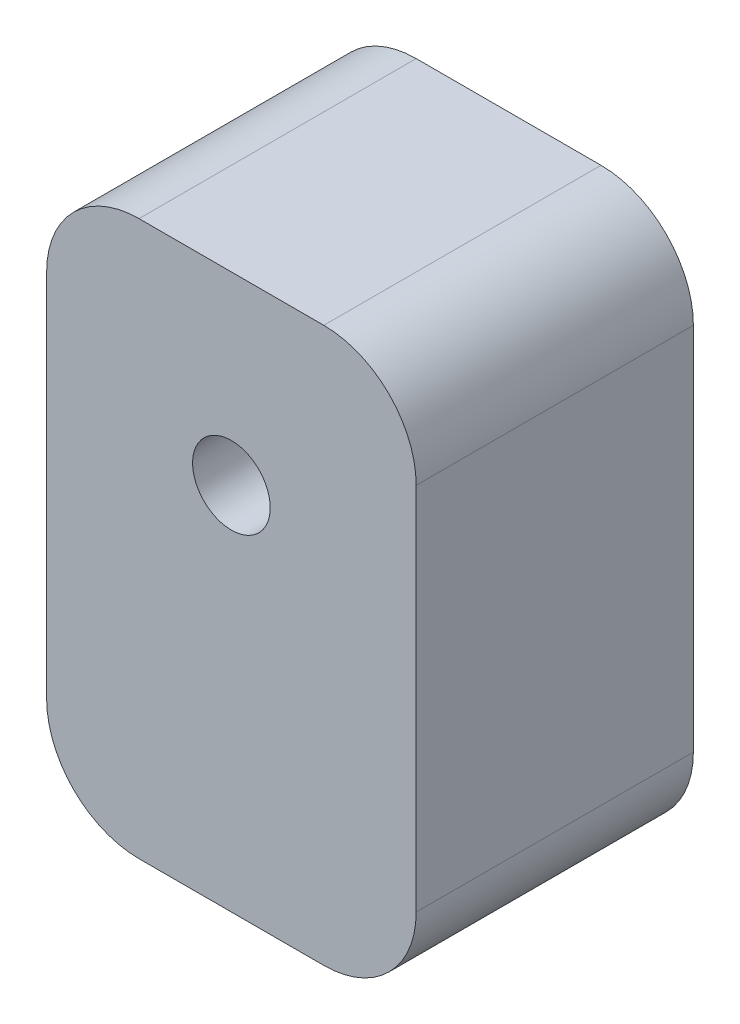
ISO-10303-21;
HEADER;
FILE_DESCRIPTION(('STEP AP214'),'2;1');
FILE_NAME('part.step','',(''),(''),'','','');
FILE_SCHEMA(('AUTOMOTIVE_DESIGN { 1 0 10303 214 1 1 1 1 }'));
ENDSEC;
DATA;
#1=APPLICATION_CONTEXT('core data for automotive mechanical design processes');
#2=APPLICATION_PROTOCOL_DEFINITION('international standard','automotive_design',2000,#1);
#3=PRODUCT_CONTEXT('',#1,'mechanical');
#4=PRODUCT('Part','Part','',(#3));
#5=PRODUCT_RELATED_PRODUCT_CATEGORY('part','',(#4));
#6=PRODUCT_DEFINITION_FORMATION('','',#4);
#7=PRODUCT_DEFINITION_CONTEXT('part definition',#1,'design');
#8=PRODUCT_DEFINITION('design','',#6,#7);
#9=PRODUCT_DEFINITION_SHAPE('','',#8);
#10=(LENGTH_UNIT() NAMED_UNIT(*) SI_UNIT(.MILLI.,.METRE.));
#11=(NAMED_UNIT(*) PLANE_ANGLE_UNIT() SI_UNIT($,.RADIAN.));
#12=(NAMED_UNIT(*) SI_UNIT($,.STERADIAN.) SOLID_ANGLE_UNIT());
#13=UNCERTAINTY_MEASURE_WITH_UNIT(LENGTH_MEASURE(1.E-05),#10,'distance_accuracy_value','');
#14=(GEOMETRIC_REPRESENTATION_CONTEXT(3) GLOBAL_UNCERTAINTY_ASSIGNED_CONTEXT((#13)) GLOBAL_UNIT_ASSIGNED_CONTEXT((#10,
#11,#12)) REPRESENTATION_CONTEXT('',''));
#15=CARTESIAN_POINT('',(0.,0.,0.));
#16=DIRECTION('',(0.,0.,1.));
#17=DIRECTION('',(1.,0.,0.));
#18=AXIS2_PLACEMENT_3D('',#15,#16,#17);
#19=CARTESIAN_POINT('',(0.,0.,0.));
#20=DIRECTION('',(0.,0.,1.));
#21=DIRECTION('',(1.,0.,0.));
#22=AXIS2_PLACEMENT_3D('',#19,#20,#21);
#23=PLANE('',#22);
#24=CARTESIAN_POINT('',(0.,5.,0.));
#25=DIRECTION('',(0.,0.,1.));
#26=DIRECTION('',(1.,0.,0.));
#27=AXIS2_PLACEMENT_3D('',#24,#25,#26);
#28=CIRCLE('',#27,2.1);
#29=CARTESIAN_POINT('',(2.1,5.,0.));
#30=VERTEX_POINT('',#29);
#31=EDGE_CURVE('E165',#30,#30,#28,.T.);
#32=ORIENTED_EDGE('',*,*,#31,.T.);
#33=EDGE_LOOP('',(#32));
#34=FACE_BOUND('',#33,.T.);
#35=DIRECTION('',(0.,1.,0.));
#36=VECTOR('',#35,1.);
#37=CARTESIAN_POINT('',(10.,15.,0.));
#38=LINE('',#37,#36);
#39=CARTESIAN_POINT('',(10.,-9.99999999999999,0.));
#40=VERTEX_POINT('',#39);
#41=CARTESIAN_POINT('',(10.,10.,0.));
#42=VERTEX_POINT('',#41);
#43=EDGE_CURVE('E178',#40,#42,#38,.T.);
#44=ORIENTED_EDGE('',*,*,#43,.F.);
#45=CARTESIAN_POINT('',(5.,-9.99999999999999,0.));
#46=DIRECTION('',(0.,0.,1.));
#47=DIRECTION('',(1.,0.,0.));
#48=AXIS2_PLACEMENT_3D('',#45,#46,#47);
#49=CIRCLE('',#48,5.);
#50=CARTESIAN_POINT('',(5.,-15.,0.));
#51=VERTEX_POINT('',#50);
#52=EDGE_CURVE('E224',#40,#51,#49,.F.);
#53=ORIENTED_EDGE('',*,*,#52,.T.);
#54=DIRECTION('',(1.,0.,0.));
#55=VECTOR('',#54,1.);
#56=CARTESIAN_POINT('',(-10.,-15.,0.));
#57=LINE('',#56,#55);
#58=CARTESIAN_POINT('',(2.9,-15.,0.));
#59=VERTEX_POINT('',#58);
#60=EDGE_CURVE('E206',#59,#51,#57,.T.);
#61=ORIENTED_EDGE('',*,*,#60,.F.);
#62=DIRECTION('',(0.,-1.,0.));
#63=VECTOR('',#62,1.);
#64=CARTESIAN_POINT('',(2.9,-4.99999999999999,0.));
#65=LINE('',#64,#63);
#66=CARTESIAN_POINT('',(2.9,-4.99999999999999,0.));
#67=VERTEX_POINT('',#66);
#68=EDGE_CURVE('E159',#67,#59,#65,.T.);
#69=ORIENTED_EDGE('',*,*,#68,.F.);
#70=DIRECTION('',(1.,0.,0.));
#71=VECTOR('',#70,1.);
#72=CARTESIAN_POINT('',(2.9,-4.99999999999999,0.));
#73=LINE('',#72,#71);
#74=CARTESIAN_POINT('',(-2.9,-4.99999999999999,0.));
#75=VERTEX_POINT('',#74);
#76=EDGE_CURVE('E278',#75,#67,#73,.T.);
#77=ORIENTED_EDGE('',*,*,#76,.F.);
#78=DIRECTION('',(0.,1.,0.));
#79=VECTOR('',#78,1.);
#80=CARTESIAN_POINT('',(-2.9,-4.99999999999999,0.));
#81=LINE('',#80,#79);
#82=CARTESIAN_POINT('',(-2.9,-15.,0.));
#83=VERTEX_POINT('',#82);
#84=EDGE_CURVE('E163',#83,#75,#81,.T.);
#85=ORIENTED_EDGE('',*,*,#84,.F.);
#86=CARTESIAN_POINT('',(-5.,-15.,0.));
#87=VERTEX_POINT('',#86);
#88=EDGE_CURVE('E185',#87,#83,#57,.T.);
#89=ORIENTED_EDGE('',*,*,#88,.F.);
#90=CARTESIAN_POINT('',(-5.,-9.99999999999999,0.));
#91=DIRECTION('',(0.,0.,1.));
#92=DIRECTION('',(1.,0.,0.));
#93=AXIS2_PLACEMENT_3D('',#90,#91,#92);
#94=CIRCLE('',#93,5.);
#95=CARTESIAN_POINT('',(-10.,-9.99999999999999,0.));
#96=VERTEX_POINT('',#95);
#97=EDGE_CURVE('E221',#87,#96,#94,.F.);
#98=ORIENTED_EDGE('',*,*,#97,.T.);
#99=DIRECTION('',(0.,-1.,0.));
#100=VECTOR('',#99,1.);
#101=CARTESIAN_POINT('',(-10.,15.,0.));
#102=LINE('',#101,#100);
#103=CARTESIAN_POINT('',(-10.,10.,0.));
#104=VERTEX_POINT('',#103);
#105=EDGE_CURVE('E203',#104,#96,#102,.T.);
#106=ORIENTED_EDGE('',*,*,#105,.F.);
#107=CARTESIAN_POINT('',(-5.,10.,0.));
#108=DIRECTION('',(0.,0.,1.));
#109=DIRECTION('',(1.,0.,0.));
#110=AXIS2_PLACEMENT_3D('',#107,#108,#109);
#111=CIRCLE('',#110,5.);
#112=CARTESIAN_POINT('',(-5.,15.,0.));
#113=VERTEX_POINT('',#112);
#114=EDGE_CURVE('E218',#104,#113,#111,.F.);
#115=ORIENTED_EDGE('',*,*,#114,.T.);
#116=DIRECTION('',(-1.,0.,0.));
#117=VECTOR('',#116,1.);
#118=CARTESIAN_POINT('',(-10.,15.,0.));
#119=LINE('',#118,#117);
#120=CARTESIAN_POINT('',(5.,15.,0.));
#121=VERTEX_POINT('',#120);
#122=EDGE_CURVE('E199',#121,#113,#119,.T.);
#123=ORIENTED_EDGE('',*,*,#122,.F.);
#124=CARTESIAN_POINT('',(5.,10.,0.));
#125=DIRECTION('',(0.,0.,1.));
#126=DIRECTION('',(1.,0.,0.));
#127=AXIS2_PLACEMENT_3D('',#124,#125,#126);
#128=CIRCLE('',#127,5.);
#129=EDGE_CURVE('E215',#121,#42,#128,.F.);
#130=ORIENTED_EDGE('',*,*,#129,.T.);
#131=EDGE_LOOP('',(#44,#53,#61,#69,#77,#85,#89,#98,#106,#115,#123,#130));
#132=FACE_BOUND('',#131,.T.);
#133=ADVANCED_FACE('F45',(#34,#132),#23,.F.);
#134=CARTESIAN_POINT('',(0.,0.,15.));
#135=DIRECTION('',(0.,0.,1.));
#136=DIRECTION('',(1.,0.,0.));
#137=AXIS2_PLACEMENT_3D('',#134,#135,#136);
#138=PLANE('',#137);
#139=DIRECTION('',(1.,0.,0.));
#140=VECTOR('',#139,1.);
#141=CARTESIAN_POINT('',(-10.,-15.,15.));
#142=LINE('',#141,#140);
#143=CARTESIAN_POINT('',(-5.,-15.,15.));
#144=VERTEX_POINT('',#143);
#145=CARTESIAN_POINT('',(5.,-15.,15.));
#146=VERTEX_POINT('',#145);
#147=EDGE_CURVE('E191',#144,#146,#142,.T.);
#148=ORIENTED_EDGE('',*,*,#147,.T.);
#149=CARTESIAN_POINT('',(5.,-9.99999999999999,15.));
#150=DIRECTION('',(0.,0.,1.));
#151=DIRECTION('',(1.,0.,0.));
#152=AXIS2_PLACEMENT_3D('',#149,#150,#151);
#153=CIRCLE('',#152,5.);
#154=CARTESIAN_POINT('',(10.,-9.99999999999999,15.));
#155=VERTEX_POINT('',#154);
#156=EDGE_CURVE('E242',#146,#155,#153,.T.);
#157=ORIENTED_EDGE('',*,*,#156,.T.);
#158=DIRECTION('',(0.,1.,0.));
#159=VECTOR('',#158,1.);
#160=CARTESIAN_POINT('',(10.,15.,15.));
#161=LINE('',#160,#159);
#162=CARTESIAN_POINT('',(10.,10.,15.));
#163=VERTEX_POINT('',#162);
#164=EDGE_CURVE('E180',#155,#163,#161,.T.);
#165=ORIENTED_EDGE('',*,*,#164,.T.);
#166=CARTESIAN_POINT('',(5.,10.,15.));
#167=DIRECTION('',(0.,0.,1.));
#168=DIRECTION('',(1.,0.,0.));
#169=AXIS2_PLACEMENT_3D('',#166,#167,#168);
#170=CIRCLE('',#169,5.);
#171=CARTESIAN_POINT('',(5.,15.,15.));
#172=VERTEX_POINT('',#171);
#173=EDGE_CURVE('E234',#163,#172,#170,.T.);
#174=ORIENTED_EDGE('',*,*,#173,.T.);
#175=DIRECTION('',(-1.,0.,0.));
#176=VECTOR('',#175,1.);
#177=CARTESIAN_POINT('',(-10.,15.,15.));
#178=LINE('',#177,#176);
#179=CARTESIAN_POINT('',(-5.,15.,15.));
#180=VERTEX_POINT('',#179);
#181=EDGE_CURVE('E184',#172,#180,#178,.T.);
#182=ORIENTED_EDGE('',*,*,#181,.T.);
#183=CARTESIAN_POINT('',(-5.,10.,15.));
#184=DIRECTION('',(0.,0.,1.));
#185=DIRECTION('',(1.,0.,0.));
#186=AXIS2_PLACEMENT_3D('',#183,#184,#185);
#187=CIRCLE('',#186,5.);
#188=CARTESIAN_POINT('',(-10.,10.,15.));
#189=VERTEX_POINT('',#188);
#190=EDGE_CURVE('E68',#180,#189,#187,.T.);
#191=ORIENTED_EDGE('',*,*,#190,.T.);
#192=DIRECTION('',(0.,-1.,0.));
#193=VECTOR('',#192,1.);
#194=CARTESIAN_POINT('',(-10.,15.,15.));
#195=LINE('',#194,#193);
#196=CARTESIAN_POINT('',(-10.,-9.99999999999999,15.));
#197=VERTEX_POINT('',#196);
#198=EDGE_CURVE('E188',#189,#197,#195,.T.);
#199=ORIENTED_EDGE('',*,*,#198,.T.);
#200=CARTESIAN_POINT('',(-5.,-9.99999999999999,15.));
#201=DIRECTION('',(0.,0.,1.));
#202=DIRECTION('',(1.,0.,0.));
#203=AXIS2_PLACEMENT_3D('',#200,#201,#202);
#204=CIRCLE('',#203,5.);
#205=EDGE_CURVE('E239',#197,#144,#204,.T.);
#206=ORIENTED_EDGE('',*,*,#205,.T.);
#207=EDGE_LOOP('',(#148,#157,#165,#174,#182,#191,#199,#206));
#208=FACE_BOUND('',#207,.T.);
#209=CARTESIAN_POINT('',(0.,5.,15.));
#210=DIRECTION('',(0.,0.,1.));
#211=DIRECTION('',(1.,0.,0.));
#212=AXIS2_PLACEMENT_3D('',#209,#210,#211);
#213=CIRCLE('',#212,2.1);
#214=CARTESIAN_POINT('',(2.1,5.,15.));
#215=VERTEX_POINT('',#214);
#216=EDGE_CURVE('E170',#215,#215,#213,.T.);
#217=ORIENTED_EDGE('',*,*,#216,.F.);
#218=EDGE_LOOP('',(#217));
#219=FACE_BOUND('',#218,.T.);
#220=ADVANCED_FACE('F268',(#208,#219),#138,.T.);
#221=CARTESIAN_POINT('',(10.,15.,15.));
#222=DIRECTION('',(-1.,0.,0.));
#223=DIRECTION('',(0.,-1.,0.));
#224=AXIS2_PLACEMENT_3D('',#221,#222,#223);
#225=PLANE('',#224);
#226=ORIENTED_EDGE('',*,*,#164,.F.);
#227=DIRECTION('',(0.,0.,-1.));
#228=VECTOR('',#227,1.);
#229=CARTESIAN_POINT('',(10.,-9.99999999999999,15.));
#230=LINE('',#229,#228);
#231=EDGE_CURVE('E211',#155,#40,#230,.T.);
#232=ORIENTED_EDGE('',*,*,#231,.T.);
#233=ORIENTED_EDGE('',*,*,#43,.T.);
#234=DIRECTION('',(0.,0.,-1.));
#235=VECTOR('',#234,1.);
#236=CARTESIAN_POINT('',(10.,10.,15.));
#237=LINE('',#236,#235);
#238=EDGE_CURVE('E195',#42,#163,#237,.F.);
#239=ORIENTED_EDGE('',*,*,#238,.T.);
#240=EDGE_LOOP('',(#226,#232,#233,#239));
#241=FACE_BOUND('',#240,.T.);
#242=ADVANCED_FACE('F306',(#241),#225,.F.);
#243=CARTESIAN_POINT('',(-10.,15.,15.));
#244=DIRECTION('',(0.,-1.,0.));
#245=DIRECTION('',(0.,0.,-1.));
#246=AXIS2_PLACEMENT_3D('',#243,#244,#245);
#247=PLANE('',#246);
#248=ORIENTED_EDGE('',*,*,#122,.T.);
#249=DIRECTION('',(0.,0.,-1.));
#250=VECTOR('',#249,1.);
#251=CARTESIAN_POINT('',(-5.,15.,15.));
#252=LINE('',#251,#250);
#253=EDGE_CURVE('E11',#113,#180,#252,.F.);
#254=ORIENTED_EDGE('',*,*,#253,.T.);
#255=ORIENTED_EDGE('',*,*,#181,.F.);
#256=DIRECTION('',(0.,0.,-1.));
#257=VECTOR('',#256,1.);
#258=CARTESIAN_POINT('',(5.,15.,15.));
#259=LINE('',#258,#257);
#260=EDGE_CURVE('E54',#172,#121,#259,.T.);
#261=ORIENTED_EDGE('',*,*,#260,.T.);
#262=EDGE_LOOP('',(#248,#254,#255,#261));
#263=FACE_BOUND('',#262,.T.);
#264=ADVANCED_FACE('F256',(#263),#247,.F.);
#265=CARTESIAN_POINT('',(-10.,15.,15.));
#266=DIRECTION('',(1.,0.,0.));
#267=DIRECTION('',(0.,1.,0.));
#268=AXIS2_PLACEMENT_3D('',#265,#266,#267);
#269=PLANE('',#268);
#270=ORIENTED_EDGE('',*,*,#105,.T.);
#271=DIRECTION('',(0.,0.,-1.));
#272=VECTOR('',#271,1.);
#273=CARTESIAN_POINT('',(-10.,-9.99999999999999,15.));
#274=LINE('',#273,#272);
#275=EDGE_CURVE('E61',#96,#197,#274,.F.);
#276=ORIENTED_EDGE('',*,*,#275,.T.);
#277=ORIENTED_EDGE('',*,*,#198,.F.);
#278=DIRECTION('',(0.,0.,-1.));
#279=VECTOR('',#278,1.);
#280=CARTESIAN_POINT('',(-10.,10.,15.));
#281=LINE('',#280,#279);
#282=EDGE_CURVE('E245',#189,#104,#281,.T.);
#283=ORIENTED_EDGE('',*,*,#282,.T.);
#284=EDGE_LOOP('',(#270,#276,#277,#283));
#285=FACE_BOUND('',#284,.T.);
#286=ADVANCED_FACE('F266',(#285),#269,.F.);
#287=CARTESIAN_POINT('',(-10.,-15.,15.));
#288=DIRECTION('',(0.,1.,0.));
#289=DIRECTION('',(0.,0.,1.));
#290=AXIS2_PLACEMENT_3D('',#287,#288,#289);
#291=PLANE('',#290);
#292=ORIENTED_EDGE('',*,*,#60,.T.);
#293=DIRECTION('',(0.,0.,-1.));
#294=VECTOR('',#293,1.);
#295=CARTESIAN_POINT('',(5.,-15.,15.));
#296=LINE('',#295,#294);
#297=EDGE_CURVE('E231',#51,#146,#296,.F.);
#298=ORIENTED_EDGE('',*,*,#297,.T.);
#299=ORIENTED_EDGE('',*,*,#147,.F.);
#300=DIRECTION('',(0.,0.,-1.));
#301=VECTOR('',#300,1.);
#302=CARTESIAN_POINT('',(-5.,-15.,15.));
#303=LINE('',#302,#301);
#304=EDGE_CURVE('E227',#144,#87,#303,.T.);
#305=ORIENTED_EDGE('',*,*,#304,.T.);
#306=ORIENTED_EDGE('',*,*,#88,.T.);
#307=DIRECTION('',(0.,0.,1.));
#308=VECTOR('',#307,1.);
#309=CARTESIAN_POINT('',(-2.9,-15.,-3.));
#310=LINE('',#309,#308);
#311=CARTESIAN_POINT('',(-2.9,-15.,-3.));
#312=VERTEX_POINT('',#311);
#313=EDGE_CURVE('E281',#312,#83,#310,.T.);
#314=ORIENTED_EDGE('',*,*,#313,.F.);
#315=DIRECTION('',(-1.,0.,0.));
#316=VECTOR('',#315,1.);
#317=CARTESIAN_POINT('',(2.9,-15.,-3.));
#318=LINE('',#317,#316);
#319=CARTESIAN_POINT('',(2.9,-15.,-3.));
#320=VERTEX_POINT('',#319);
#321=EDGE_CURVE('E154',#320,#312,#318,.T.);
#322=ORIENTED_EDGE('',*,*,#321,.F.);
#323=DIRECTION('',(0.,0.,1.));
#324=VECTOR('',#323,1.);
#325=CARTESIAN_POINT('',(2.9,-15.,-3.));
#326=LINE('',#325,#324);
#327=EDGE_CURVE('E172',#320,#59,#326,.T.);
#328=ORIENTED_EDGE('',*,*,#327,.T.);
#329=EDGE_LOOP('',(#292,#298,#299,#305,#306,#314,#322,#328));
#330=FACE_BOUND('',#329,.T.);
#331=ADVANCED_FACE('F277',(#330),#291,.F.);
#332=CARTESIAN_POINT('',(0.,5.,15.));
#333=DIRECTION('',(0.,0.,-1.));
#334=DIRECTION('',(-1.,0.,0.));
#335=AXIS2_PLACEMENT_3D('',#332,#333,#334);
#336=CYLINDRICAL_SURFACE('',#335,2.1);
#337=ORIENTED_EDGE('',*,*,#216,.T.);
#338=EDGE_LOOP('',(#337));
#339=FACE_BOUND('',#338,.T.);
#340=ORIENTED_EDGE('',*,*,#31,.F.);
#341=EDGE_LOOP('',(#340));
#342=FACE_BOUND('',#341,.T.);
#343=ADVANCED_FACE('F324',(#339,#342),#336,.F.);
#344=CARTESIAN_POINT('',(-2.9,-4.99999999999999,-3.));
#345=DIRECTION('',(1.,0.,0.));
#346=DIRECTION('',(0.,1.,0.));
#347=AXIS2_PLACEMENT_3D('',#344,#345,#346);
#348=PLANE('',#347);
#349=ORIENTED_EDGE('',*,*,#84,.T.);
#350=DIRECTION('',(0.,0.,1.));
#351=VECTOR('',#350,1.);
#352=CARTESIAN_POINT('',(-2.9,-4.99999999999999,-3.));
#353=LINE('',#352,#351);
#354=CARTESIAN_POINT('',(-2.9,-4.99999999999999,-3.));
#355=VERTEX_POINT('',#354);
#356=EDGE_CURVE('E141',#355,#75,#353,.T.);
#357=ORIENTED_EDGE('',*,*,#356,.F.);
#358=DIRECTION('',(0.,1.,0.));
#359=VECTOR('',#358,1.);
#360=CARTESIAN_POINT('',(-2.9,-4.99999999999999,-3.));
#361=LINE('',#360,#359);
#362=EDGE_CURVE('E149',#312,#355,#361,.T.);
#363=ORIENTED_EDGE('',*,*,#362,.F.);
#364=ORIENTED_EDGE('',*,*,#313,.T.);
#365=EDGE_LOOP('',(#349,#357,#363,#364));
#366=FACE_BOUND('',#365,.T.);
#367=ADVANCED_FACE('F161',(#366),#348,.F.);
#368=CARTESIAN_POINT('',(2.9,-4.99999999999999,-3.));
#369=DIRECTION('',(0.,-1.,0.));
#370=DIRECTION('',(0.,0.,-1.));
#371=AXIS2_PLACEMENT_3D('',#368,#369,#370);
#372=PLANE('',#371);
#373=ORIENTED_EDGE('',*,*,#76,.T.);
#374=DIRECTION('',(0.,0.,1.));
#375=VECTOR('',#374,1.);
#376=CARTESIAN_POINT('',(2.9,-4.99999999999999,-3.));
#377=LINE('',#376,#375);
#378=CARTESIAN_POINT('',(2.9,-4.99999999999999,-3.));
#379=VERTEX_POINT('',#378);
#380=EDGE_CURVE('E144',#379,#67,#377,.T.);
#381=ORIENTED_EDGE('',*,*,#380,.F.);
#382=DIRECTION('',(1.,0.,0.));
#383=VECTOR('',#382,1.);
#384=CARTESIAN_POINT('',(2.9,-4.99999999999999,-3.));
#385=LINE('',#384,#383);
#386=EDGE_CURVE('E136',#355,#379,#385,.T.);
#387=ORIENTED_EDGE('',*,*,#386,.F.);
#388=ORIENTED_EDGE('',*,*,#356,.T.);
#389=EDGE_LOOP('',(#373,#381,#387,#388));
#390=FACE_BOUND('',#389,.T.);
#391=ADVANCED_FACE('F139',(#390),#372,.F.);
#392=CARTESIAN_POINT('',(2.9,-4.99999999999999,-3.));
#393=DIRECTION('',(-1.,0.,0.));
#394=DIRECTION('',(0.,-1.,0.));
#395=AXIS2_PLACEMENT_3D('',#392,#393,#394);
#396=PLANE('',#395);
#397=ORIENTED_EDGE('',*,*,#68,.T.);
#398=ORIENTED_EDGE('',*,*,#327,.F.);
#399=DIRECTION('',(0.,-1.,0.));
#400=VECTOR('',#399,1.);
#401=CARTESIAN_POINT('',(2.9,-4.99999999999999,-3.));
#402=LINE('',#401,#400);
#403=EDGE_CURVE('E148',#379,#320,#402,.T.);
#404=ORIENTED_EDGE('',*,*,#403,.F.);
#405=ORIENTED_EDGE('',*,*,#380,.T.);
#406=EDGE_LOOP('',(#397,#398,#404,#405));
#407=FACE_BOUND('',#406,.T.);
#408=ADVANCED_FACE('F297',(#407),#396,.F.);
#409=CARTESIAN_POINT('',(0.,0.,-3.));
#410=DIRECTION('',(0.,0.,-1.));
#411=DIRECTION('',(-1.,0.,0.));
#412=AXIS2_PLACEMENT_3D('',#409,#410,#411);
#413=PLANE('',#412);
#414=ORIENTED_EDGE('',*,*,#362,.T.);
#415=ORIENTED_EDGE('',*,*,#386,.T.);
#416=ORIENTED_EDGE('',*,*,#403,.T.);
#417=ORIENTED_EDGE('',*,*,#321,.T.);
#418=EDGE_LOOP('',(#414,#415,#416,#417));
#419=FACE_BOUND('',#418,.T.);
#420=ADVANCED_FACE('F152',(#419),#413,.T.);
#421=CARTESIAN_POINT('',(5.,-9.99999999999999,15.));
#422=DIRECTION('',(0.,0.,-1.));
#423=DIRECTION('',(-1.,0.,0.));
#424=AXIS2_PLACEMENT_3D('',#421,#422,#423);
#425=CYLINDRICAL_SURFACE('',#424,5.);
#426=ORIENTED_EDGE('',*,*,#156,.F.);
#427=ORIENTED_EDGE('',*,*,#297,.F.);
#428=ORIENTED_EDGE('',*,*,#52,.F.);
#429=ORIENTED_EDGE('',*,*,#231,.F.);
#430=EDGE_LOOP('',(#426,#427,#428,#429));
#431=FACE_BOUND('',#430,.T.);
#432=ADVANCED_FACE('F302',(#431),#425,.T.);
#433=CARTESIAN_POINT('',(-5.,-9.99999999999999,15.));
#434=DIRECTION('',(0.,0.,-1.));
#435=DIRECTION('',(-1.,0.,0.));
#436=AXIS2_PLACEMENT_3D('',#433,#434,#435);
#437=CYLINDRICAL_SURFACE('',#436,5.);
#438=ORIENTED_EDGE('',*,*,#205,.F.);
#439=ORIENTED_EDGE('',*,*,#275,.F.);
#440=ORIENTED_EDGE('',*,*,#97,.F.);
#441=ORIENTED_EDGE('',*,*,#304,.F.);
#442=EDGE_LOOP('',(#438,#439,#440,#441));
#443=FACE_BOUND('',#442,.T.);
#444=ADVANCED_FACE('F273',(#443),#437,.T.);
#445=CARTESIAN_POINT('',(-5.,10.,15.));
#446=DIRECTION('',(0.,0.,-1.));
#447=DIRECTION('',(-1.,0.,0.));
#448=AXIS2_PLACEMENT_3D('',#445,#446,#447);
#449=CYLINDRICAL_SURFACE('',#448,5.);
#450=ORIENTED_EDGE('',*,*,#190,.F.);
#451=ORIENTED_EDGE('',*,*,#253,.F.);
#452=ORIENTED_EDGE('',*,*,#114,.F.);
#453=ORIENTED_EDGE('',*,*,#282,.F.);
#454=EDGE_LOOP('',(#450,#451,#452,#453));
#455=FACE_BOUND('',#454,.T.);
#456=ADVANCED_FACE('F265',(#455),#449,.T.);
#457=CARTESIAN_POINT('',(5.,10.,15.));
#458=DIRECTION('',(0.,0.,-1.));
#459=DIRECTION('',(-1.,0.,0.));
#460=AXIS2_PLACEMENT_3D('',#457,#458,#459);
#461=CYLINDRICAL_SURFACE('',#460,5.);
#462=ORIENTED_EDGE('',*,*,#173,.F.);
#463=ORIENTED_EDGE('',*,*,#238,.F.);
#464=ORIENTED_EDGE('',*,*,#129,.F.);
#465=ORIENTED_EDGE('',*,*,#260,.F.);
#466=EDGE_LOOP('',(#462,#463,#464,#465));
#467=FACE_BOUND('',#466,.T.);
#468=ADVANCED_FACE('F47',(#467),#461,.T.);
#469=CLOSED_SHELL('',(#133,#220,#242,#264,#286,#331,#343,#367,#391,#408,#420,#432,#444,#456,#468));
#470=MANIFOLD_SOLID_BREP('B2',#469);
#471=ADVANCED_BREP_SHAPE_REPRESENTATION('',(#18,#470),#14);
#472=SHAPE_DEFINITION_REPRESENTATION(#9,#471);
ENDSEC;
END-ISO-10303-21;
